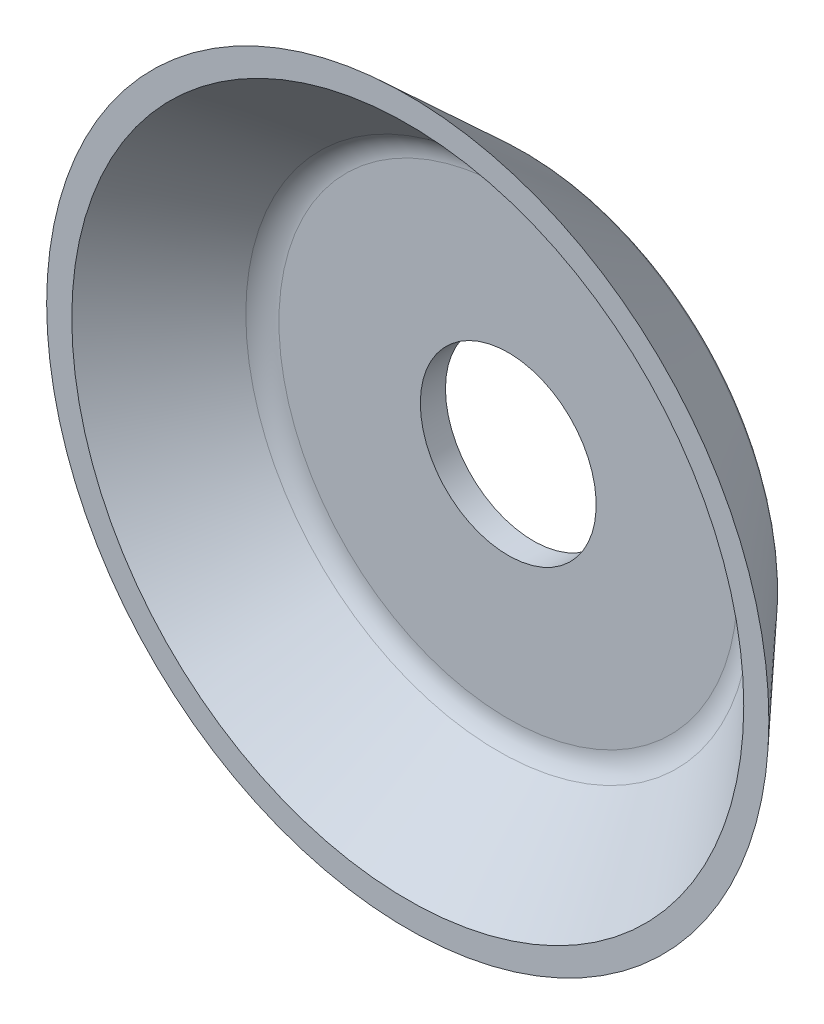
ISO-10303-21;
HEADER;
FILE_DESCRIPTION(('STEP AP214'),'2;1');
FILE_NAME('part.step','',(''),(''),'','','');
FILE_SCHEMA(('AUTOMOTIVE_DESIGN { 1 0 10303 214 1 1 1 1 }'));
ENDSEC;
DATA;
#1=APPLICATION_CONTEXT('core data for automotive mechanical design processes');
#2=APPLICATION_PROTOCOL_DEFINITION('international standard','automotive_design',2000,#1);
#3=PRODUCT_CONTEXT('',#1,'mechanical');
#4=PRODUCT('Part','Part','',(#3));
#5=PRODUCT_RELATED_PRODUCT_CATEGORY('part','',(#4));
#6=PRODUCT_DEFINITION_FORMATION('','',#4);
#7=PRODUCT_DEFINITION_CONTEXT('part definition',#1,'design');
#8=PRODUCT_DEFINITION('design','',#6,#7);
#9=PRODUCT_DEFINITION_SHAPE('','',#8);
#10=(LENGTH_UNIT() NAMED_UNIT(*) SI_UNIT(.MILLI.,.METRE.));
#11=(NAMED_UNIT(*) PLANE_ANGLE_UNIT() SI_UNIT($,.RADIAN.));
#12=(NAMED_UNIT(*) SI_UNIT($,.STERADIAN.) SOLID_ANGLE_UNIT());
#13=UNCERTAINTY_MEASURE_WITH_UNIT(LENGTH_MEASURE(1.E-05),#10,'distance_accuracy_value','');
#14=(GEOMETRIC_REPRESENTATION_CONTEXT(3) GLOBAL_UNCERTAINTY_ASSIGNED_CONTEXT((#13)) GLOBAL_UNIT_ASSIGNED_CONTEXT((#10,
#11,#12)) REPRESENTATION_CONTEXT('',''));
#15=CARTESIAN_POINT('',(0.,0.,0.));
#16=DIRECTION('',(0.,0.,1.));
#17=DIRECTION('',(1.,0.,0.));
#18=AXIS2_PLACEMENT_3D('',#15,#16,#17);
#19=CARTESIAN_POINT('',(0.,0.,0.));
#20=DIRECTION('',(0.,0.,-1.));
#21=DIRECTION('',(-1.,0.,0.));
#22=AXIS2_PLACEMENT_3D('',#19,#20,#21);
#23=CYLINDRICAL_SURFACE('',#22,2.8);
#24=CARTESIAN_POINT('',(0.,0.,0.));
#25=DIRECTION('',(0.,0.,-1.));
#26=DIRECTION('',(-1.,0.,0.));
#27=AXIS2_PLACEMENT_3D('',#24,#25,#26);
#28=CIRCLE('',#27,2.8);
#29=CARTESIAN_POINT('',(-2.8,0.,0.));
#30=VERTEX_POINT('',#29);
#31=EDGE_CURVE('E53',#30,#30,#28,.T.);
#32=ORIENTED_EDGE('',*,*,#31,.T.);
#33=EDGE_LOOP('',(#32));
#34=FACE_BOUND('',#33,.T.);
#35=CARTESIAN_POINT('',(0.,0.,0.8));
#36=DIRECTION('',(0.,0.,-1.));
#37=DIRECTION('',(-1.,0.,0.));
#38=AXIS2_PLACEMENT_3D('',#35,#36,#37);
#39=CIRCLE('',#38,2.8);
#40=CARTESIAN_POINT('',(-2.8,0.,0.8));
#41=VERTEX_POINT('',#40);
#42=EDGE_CURVE('E62',#41,#41,#39,.T.);
#43=ORIENTED_EDGE('',*,*,#42,.F.);
#44=EDGE_LOOP('',(#43));
#45=FACE_BOUND('',#44,.T.);
#46=ADVANCED_FACE('F33',(#34,#45),#23,.F.);
#47=CARTESIAN_POINT('',(0.,2.8,0.));
#48=DIRECTION('',(0.,0.,-1.));
#49=DIRECTION('',(-1.,0.,0.));
#50=AXIS2_PLACEMENT_3D('',#47,#48,#49);
#51=PLANE('',#50);
#52=CARTESIAN_POINT('',(0.,0.,0.));
#53=DIRECTION('',(0.,0.,-1.));
#54=DIRECTION('',(-1.,0.,0.));
#55=AXIS2_PLACEMENT_3D('',#52,#53,#54);
#56=CIRCLE('',#55,7.36278672741747);
#57=CARTESIAN_POINT('',(-7.36278672741747,0.,0.));
#58=VERTEX_POINT('',#57);
#59=EDGE_CURVE('E40',#58,#58,#56,.T.);
#60=ORIENTED_EDGE('',*,*,#59,.T.);
#61=EDGE_LOOP('',(#60));
#62=FACE_BOUND('',#61,.T.);
#63=ORIENTED_EDGE('',*,*,#31,.F.);
#64=EDGE_LOOP('',(#63));
#65=FACE_BOUND('',#64,.T.);
#66=ADVANCED_FACE('F69',(#62,#65),#51,.T.);
#67=CARTESIAN_POINT('',(0.,0.,0.));
#68=DIRECTION('',(0.,0.,1.));
#69=DIRECTION('',(1.,0.,0.));
#70=AXIS2_PLACEMENT_3D('',#67,#68,#69);
#71=CONICAL_SURFACE('',#70,7.8,0.746456820300409);
#72=CARTESIAN_POINT('',(0.,0.,0.320958018382573));
#73=DIRECTION('',(0.,0.,-1.));
#74=DIRECTION('',(-1.,0.,0.));
#75=AXIS2_PLACEMENT_3D('',#72,#73,#74);
#76=CIRCLE('',#75,8.09688616700388);
#77=CARTESIAN_POINT('',(-8.09688616700388,0.,0.320958018382573));
#78=VERTEX_POINT('',#77);
#79=EDGE_CURVE('E10',#78,#78,#76,.F.);
#80=ORIENTED_EDGE('',*,*,#79,.T.);
#81=EDGE_LOOP('',(#80));
#82=FACE_BOUND('',#81,.T.);
#83=CARTESIAN_POINT('',(0.,0.,4.));
#84=DIRECTION('',(0.,0.,-1.));
#85=DIRECTION('',(-1.,0.,0.));
#86=AXIS2_PLACEMENT_3D('',#83,#84,#85);
#87=CIRCLE('',#86,11.5);
#88=CARTESIAN_POINT('',(-11.5,0.,4.));
#89=VERTEX_POINT('',#88);
#90=EDGE_CURVE('E56',#89,#89,#87,.T.);
#91=ORIENTED_EDGE('',*,*,#90,.T.);
#92=EDGE_LOOP('',(#91));
#93=FACE_BOUND('',#92,.T.);
#94=ADVANCED_FACE('F75',(#82,#93),#71,.T.);
#95=CARTESIAN_POINT('',(0.,11.5,4.));
#96=DIRECTION('',(0.,0.,1.));
#97=DIRECTION('',(1.,0.,0.));
#98=AXIS2_PLACEMENT_3D('',#95,#96,#97);
#99=PLANE('',#98);
#100=CARTESIAN_POINT('',(0.,0.,4.));
#101=DIRECTION('',(0.,0.,-1.));
#102=DIRECTION('',(-1.,0.,0.));
#103=AXIS2_PLACEMENT_3D('',#100,#101,#102);
#104=CIRCLE('',#103,10.7);
#105=CARTESIAN_POINT('',(-10.7,0.,4.));
#106=VERTEX_POINT('',#105);
#107=EDGE_CURVE('E59',#106,#106,#104,.T.);
#108=ORIENTED_EDGE('',*,*,#107,.T.);
#109=EDGE_LOOP('',(#108));
#110=FACE_BOUND('',#109,.T.);
#111=ORIENTED_EDGE('',*,*,#90,.F.);
#112=EDGE_LOOP('',(#111));
#113=FACE_BOUND('',#112,.T.);
#114=ADVANCED_FACE('F95',(#110,#113),#99,.T.);
#115=CARTESIAN_POINT('',(0.,0.,4.));
#116=DIRECTION('',(0.,0.,1.));
#117=DIRECTION('',(1.,0.,0.));
#118=AXIS2_PLACEMENT_3D('',#115,#116,#117);
#119=CONICAL_SURFACE('',#118,10.7,0.746456820300409);
#120=CARTESIAN_POINT('',(0.,0.,1.12095801838257));
#121=DIRECTION('',(0.,0.,1.));
#122=DIRECTION('',(1.,0.,0.));
#123=AXIS2_PLACEMENT_3D('',#120,#121,#122);
#124=CIRCLE('',#123,8.03688616700388);
#125=CARTESIAN_POINT('',(8.03688616700388,0.,1.12095801838257));
#126=VERTEX_POINT('',#125);
#127=EDGE_CURVE('E48',#126,#126,#124,.F.);
#128=ORIENTED_EDGE('',*,*,#127,.T.);
#129=EDGE_LOOP('',(#128));
#130=FACE_BOUND('',#129,.T.);
#131=ORIENTED_EDGE('',*,*,#107,.F.);
#132=EDGE_LOOP('',(#131));
#133=FACE_BOUND('',#132,.T.);
#134=ADVANCED_FACE('F86',(#130,#133),#119,.F.);
#135=CARTESIAN_POINT('',(0.,7.74,0.8));
#136=DIRECTION('',(0.,0.,1.));
#137=DIRECTION('',(1.,0.,0.));
#138=AXIS2_PLACEMENT_3D('',#135,#136,#137);
#139=PLANE('',#138);
#140=CARTESIAN_POINT('',(0.,0.,0.8));
#141=DIRECTION('',(0.,0.,1.));
#142=DIRECTION('',(1.,0.,0.));
#143=AXIS2_PLACEMENT_3D('',#140,#141,#142);
#144=CIRCLE('',#143,7.30278672741747);
#145=CARTESIAN_POINT('',(7.30278672741747,0.,0.8));
#146=VERTEX_POINT('',#145);
#147=EDGE_CURVE('E44',#146,#146,#144,.T.);
#148=ORIENTED_EDGE('',*,*,#147,.T.);
#149=EDGE_LOOP('',(#148));
#150=FACE_BOUND('',#149,.T.);
#151=ORIENTED_EDGE('',*,*,#42,.T.);
#152=EDGE_LOOP('',(#151));
#153=FACE_BOUND('',#152,.T.);
#154=ADVANCED_FACE('F66',(#150,#153),#139,.T.);
#155=CARTESIAN_POINT('',(0.,0.,1.8));
#156=DIRECTION('',(0.,0.,1.));
#157=DIRECTION('',(1.,0.,0.));
#158=AXIS2_PLACEMENT_3D('',#155,#156,#157);
#159=TOROIDAL_SURFACE('',#158,7.30278672741747,1.);
#160=ORIENTED_EDGE('',*,*,#147,.F.);
#161=EDGE_LOOP('',(#160));
#162=FACE_BOUND('',#161,.T.);
#163=ORIENTED_EDGE('',*,*,#127,.F.);
#164=EDGE_LOOP('',(#163));
#165=FACE_BOUND('',#164,.T.);
#166=ADVANCED_FACE('F78',(#162,#165),#159,.F.);
#167=CARTESIAN_POINT('',(0.,0.,1.));
#168=DIRECTION('',(0.,0.,-1.));
#169=DIRECTION('',(-1.,0.,0.));
#170=AXIS2_PLACEMENT_3D('',#167,#168,#169);
#171=TOROIDAL_SURFACE('',#170,7.36278672741747,1.);
#172=ORIENTED_EDGE('',*,*,#79,.F.);
#173=EDGE_LOOP('',(#172));
#174=FACE_BOUND('',#173,.T.);
#175=ORIENTED_EDGE('',*,*,#59,.F.);
#176=EDGE_LOOP('',(#175));
#177=FACE_BOUND('',#176,.T.);
#178=ADVANCED_FACE('F35',(#174,#177),#171,.T.);
#179=CLOSED_SHELL('',(#46,#66,#94,#114,#134,#154,#166,#178));
#180=MANIFOLD_SOLID_BREP('B2',#179);
#181=ADVANCED_BREP_SHAPE_REPRESENTATION('',(#18,#180),#14);
#182=SHAPE_DEFINITION_REPRESENTATION(#9,#181);
ENDSEC;
END-ISO-10303-21;
